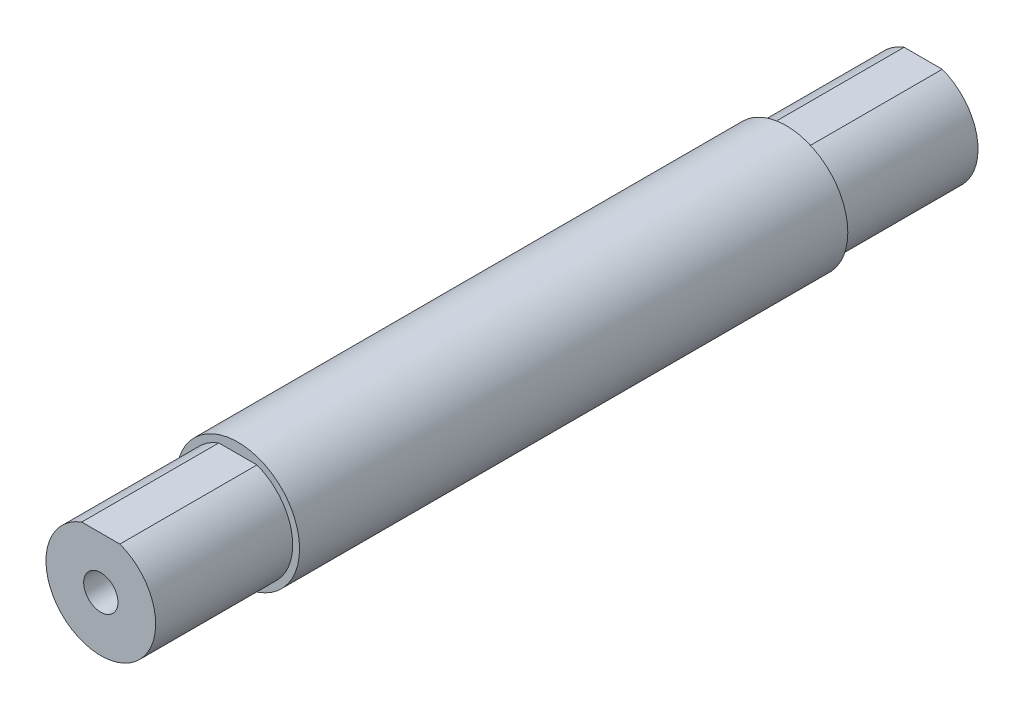
ISO-10303-21;
HEADER;
FILE_DESCRIPTION(('STEP AP214'),'2;1');
FILE_NAME('part.step','',(''),(''),'','','');
FILE_SCHEMA(('AUTOMOTIVE_DESIGN { 1 0 10303 214 1 1 1 1 }'));
ENDSEC;
DATA;
#1=APPLICATION_CONTEXT('core data for automotive mechanical design processes');
#2=APPLICATION_PROTOCOL_DEFINITION('international standard','automotive_design',2000,#1);
#3=PRODUCT_CONTEXT('',#1,'mechanical');
#4=PRODUCT('Part','Part','',(#3));
#5=PRODUCT_RELATED_PRODUCT_CATEGORY('part','',(#4));
#6=PRODUCT_DEFINITION_FORMATION('','',#4);
#7=PRODUCT_DEFINITION_CONTEXT('part definition',#1,'design');
#8=PRODUCT_DEFINITION('design','',#6,#7);
#9=PRODUCT_DEFINITION_SHAPE('','',#8);
#10=(LENGTH_UNIT() NAMED_UNIT(*) SI_UNIT(.MILLI.,.METRE.));
#11=(NAMED_UNIT(*) PLANE_ANGLE_UNIT() SI_UNIT($,.RADIAN.));
#12=(NAMED_UNIT(*) SI_UNIT($,.STERADIAN.) SOLID_ANGLE_UNIT());
#13=UNCERTAINTY_MEASURE_WITH_UNIT(LENGTH_MEASURE(1.E-05),#10,'distance_accuracy_value','');
#14=(GEOMETRIC_REPRESENTATION_CONTEXT(3) GLOBAL_UNCERTAINTY_ASSIGNED_CONTEXT((#13)) GLOBAL_UNIT_ASSIGNED_CONTEXT((#10,
#11,#12)) REPRESENTATION_CONTEXT('',''));
#15=CARTESIAN_POINT('',(0.,0.,0.));
#16=DIRECTION('',(0.,0.,1.));
#17=DIRECTION('',(1.,0.,0.));
#18=AXIS2_PLACEMENT_3D('',#15,#16,#17);
#19=CARTESIAN_POINT('',(0.,7.5,60.));
#20=DIRECTION('',(0.,1.,0.));
#21=DIRECTION('',(0.,0.,1.));
#22=AXIS2_PLACEMENT_3D('',#19,#20,#21);
#23=PLANE('',#22);
#24=DIRECTION('',(1.,0.,0.));
#25=VECTOR('',#24,1.);
#26=CARTESIAN_POINT('',(0.,7.5,40.));
#27=LINE('',#26,#25);
#28=CARTESIAN_POINT('',(-2.78388218141501,7.5,40.));
#29=VERTEX_POINT('',#28);
#30=CARTESIAN_POINT('',(2.78388218141501,7.5,40.));
#31=VERTEX_POINT('',#30);
#32=EDGE_CURVE('E59',#29,#31,#27,.T.);
#33=ORIENTED_EDGE('',*,*,#32,.F.);
#34=DIRECTION('',(0.,0.,-1.));
#35=VECTOR('',#34,1.);
#36=CARTESIAN_POINT('',(-2.78388218141501,7.5,60.));
#37=LINE('',#36,#35);
#38=CARTESIAN_POINT('',(-2.78388218141501,7.5,60.));
#39=VERTEX_POINT('',#38);
#40=EDGE_CURVE('E11',#39,#29,#37,.T.);
#41=ORIENTED_EDGE('',*,*,#40,.F.);
#42=DIRECTION('',(1.,0.,0.));
#43=VECTOR('',#42,1.);
#44=CARTESIAN_POINT('',(0.,7.5,60.));
#45=LINE('',#44,#43);
#46=CARTESIAN_POINT('',(2.78388218141501,7.5,60.));
#47=VERTEX_POINT('',#46);
#48=EDGE_CURVE('E117',#39,#47,#45,.T.);
#49=ORIENTED_EDGE('',*,*,#48,.T.);
#50=DIRECTION('',(0.,0.,-1.));
#51=VECTOR('',#50,1.);
#52=CARTESIAN_POINT('',(2.78388218141501,7.5,60.));
#53=LINE('',#52,#51);
#54=EDGE_CURVE('E127',#47,#31,#53,.T.);
#55=ORIENTED_EDGE('',*,*,#54,.T.);
#56=EDGE_LOOP('',(#33,#41,#49,#55));
#57=FACE_BOUND('',#56,.T.);
#58=ADVANCED_FACE('F38',(#57),#23,.T.);
#59=CARTESIAN_POINT('',(0.,0.,60.));
#60=DIRECTION('',(0.,0.,-1.));
#61=DIRECTION('',(-1.,0.,0.));
#62=AXIS2_PLACEMENT_3D('',#59,#60,#61);
#63=CYLINDRICAL_SURFACE('',#62,8.);
#64=ORIENTED_EDGE('',*,*,#40,.T.);
#65=CARTESIAN_POINT('',(0.,0.,40.));
#66=DIRECTION('',(0.,0.,1.));
#67=DIRECTION('',(1.,0.,0.));
#68=AXIS2_PLACEMENT_3D('',#65,#66,#67);
#69=CIRCLE('',#68,8.);
#70=EDGE_CURVE('E103',#29,#31,#69,.T.);
#71=ORIENTED_EDGE('',*,*,#70,.T.);
#72=ORIENTED_EDGE('',*,*,#54,.F.);
#73=CARTESIAN_POINT('',(0.,0.,60.));
#74=DIRECTION('',(0.,0.,1.));
#75=DIRECTION('',(1.,0.,0.));
#76=AXIS2_PLACEMENT_3D('',#73,#74,#75);
#77=CIRCLE('',#76,8.);
#78=EDGE_CURVE('E120',#39,#47,#77,.T.);
#79=ORIENTED_EDGE('',*,*,#78,.F.);
#80=EDGE_LOOP('',(#64,#71,#72,#79));
#81=FACE_BOUND('',#80,.T.);
#82=ADVANCED_FACE('F147',(#81),#63,.T.);
#83=CARTESIAN_POINT('',(0.,-19.9414213562373,60.));
#84=DIRECTION('',(0.,0.,1.));
#85=DIRECTION('',(1.,0.,0.));
#86=AXIS2_PLACEMENT_3D('',#83,#84,#85);
#87=PLANE('',#86);
#88=CARTESIAN_POINT('',(0.,0.,60.));
#89=DIRECTION('',(0.,0.,1.));
#90=DIRECTION('',(1.,0.,0.));
#91=AXIS2_PLACEMENT_3D('',#88,#89,#90);
#92=CIRCLE('',#91,2.49999999999999);
#93=CARTESIAN_POINT('',(2.49999999999999,0.,60.));
#94=VERTEX_POINT('',#93);
#95=EDGE_CURVE('E92',#94,#94,#92,.T.);
#96=ORIENTED_EDGE('',*,*,#95,.F.);
#97=EDGE_LOOP('',(#96));
#98=FACE_BOUND('',#97,.T.);
#99=ORIENTED_EDGE('',*,*,#48,.F.);
#100=ORIENTED_EDGE('',*,*,#78,.T.);
#101=EDGE_LOOP('',(#99,#100));
#102=FACE_BOUND('',#101,.T.);
#103=ADVANCED_FACE('F157',(#98,#102),#87,.T.);
#104=CARTESIAN_POINT('',(0.,0.,40.));
#105=DIRECTION('',(0.,0.,-1.));
#106=DIRECTION('',(-1.,0.,0.));
#107=AXIS2_PLACEMENT_3D('',#104,#105,#106);
#108=CYLINDRICAL_SURFACE('',#107,9.);
#109=CARTESIAN_POINT('',(0.,0.,40.));
#110=DIRECTION('',(0.,0.,1.));
#111=DIRECTION('',(1.,0.,0.));
#112=AXIS2_PLACEMENT_3D('',#109,#110,#111);
#113=CIRCLE('',#112,9.);
#114=CARTESIAN_POINT('',(9.,0.,40.));
#115=VERTEX_POINT('',#114);
#116=EDGE_CURVE('E107',#115,#115,#113,.T.);
#117=ORIENTED_EDGE('',*,*,#116,.F.);
#118=EDGE_LOOP('',(#117));
#119=FACE_BOUND('',#118,.T.);
#120=CARTESIAN_POINT('',(0.,0.,-40.));
#121=DIRECTION('',(0.,0.,1.));
#122=DIRECTION('',(1.,0.,0.));
#123=AXIS2_PLACEMENT_3D('',#120,#121,#122);
#124=CIRCLE('',#123,9.);
#125=CARTESIAN_POINT('',(9.,0.,-40.));
#126=VERTEX_POINT('',#125);
#127=EDGE_CURVE('E105',#126,#126,#124,.T.);
#128=ORIENTED_EDGE('',*,*,#127,.T.);
#129=EDGE_LOOP('',(#128));
#130=FACE_BOUND('',#129,.T.);
#131=ADVANCED_FACE('F174',(#119,#130),#108,.T.);
#132=CARTESIAN_POINT('',(0.,-19.9414213562373,40.));
#133=DIRECTION('',(0.,0.,1.));
#134=DIRECTION('',(1.,0.,0.));
#135=AXIS2_PLACEMENT_3D('',#132,#133,#134);
#136=PLANE('',#135);
#137=ORIENTED_EDGE('',*,*,#70,.F.);
#138=ORIENTED_EDGE('',*,*,#32,.T.);
#139=EDGE_LOOP('',(#137,#138));
#140=FACE_BOUND('',#139,.T.);
#141=ORIENTED_EDGE('',*,*,#116,.T.);
#142=EDGE_LOOP('',(#141));
#143=FACE_BOUND('',#142,.T.);
#144=ADVANCED_FACE('F148',(#140,#143),#136,.T.);
#145=CARTESIAN_POINT('',(0.,-19.9414213562373,-40.));
#146=DIRECTION('',(0.,0.,1.));
#147=DIRECTION('',(1.,0.,0.));
#148=AXIS2_PLACEMENT_3D('',#145,#146,#147);
#149=PLANE('',#148);
#150=CARTESIAN_POINT('',(0.,0.,-40.));
#151=DIRECTION('',(0.,0.,1.));
#152=DIRECTION('',(1.,0.,0.));
#153=AXIS2_PLACEMENT_3D('',#150,#151,#152);
#154=CIRCLE('',#153,8.);
#155=CARTESIAN_POINT('',(-2.78388218141501,7.5,-40.));
#156=VERTEX_POINT('',#155);
#157=CARTESIAN_POINT('',(2.78388218141501,7.5,-40.));
#158=VERTEX_POINT('',#157);
#159=EDGE_CURVE('E52',#156,#158,#154,.T.);
#160=ORIENTED_EDGE('',*,*,#159,.T.);
#161=DIRECTION('',(1.,0.,0.));
#162=VECTOR('',#161,1.);
#163=CARTESIAN_POINT('',(0.,7.5,-40.));
#164=LINE('',#163,#162);
#165=EDGE_CURVE('E112',#156,#158,#164,.T.);
#166=ORIENTED_EDGE('',*,*,#165,.F.);
#167=EDGE_LOOP('',(#160,#166));
#168=FACE_BOUND('',#167,.T.);
#169=ORIENTED_EDGE('',*,*,#127,.F.);
#170=EDGE_LOOP('',(#169));
#171=FACE_BOUND('',#170,.T.);
#172=ADVANCED_FACE('F140',(#168,#171),#149,.F.);
#173=CARTESIAN_POINT('',(0.,-19.9414213562373,-60.));
#174=DIRECTION('',(0.,0.,1.));
#175=DIRECTION('',(1.,0.,0.));
#176=AXIS2_PLACEMENT_3D('',#173,#174,#175);
#177=PLANE('',#176);
#178=CARTESIAN_POINT('',(0.,0.,-60.));
#179=DIRECTION('',(0.,0.,-1.));
#180=DIRECTION('',(-1.,0.,0.));
#181=AXIS2_PLACEMENT_3D('',#178,#179,#180);
#182=CIRCLE('',#181,2.49999999999999);
#183=CARTESIAN_POINT('',(-2.49999999999999,0.,-60.));
#184=VERTEX_POINT('',#183);
#185=EDGE_CURVE('E93',#184,#184,#182,.T.);
#186=ORIENTED_EDGE('',*,*,#185,.F.);
#187=EDGE_LOOP('',(#186));
#188=FACE_BOUND('',#187,.T.);
#189=DIRECTION('',(1.,0.,0.));
#190=VECTOR('',#189,1.);
#191=CARTESIAN_POINT('',(0.,7.5,-60.));
#192=LINE('',#191,#190);
#193=CARTESIAN_POINT('',(-2.78388218141501,7.5,-60.));
#194=VERTEX_POINT('',#193);
#195=CARTESIAN_POINT('',(2.78388218141501,7.5,-60.));
#196=VERTEX_POINT('',#195);
#197=EDGE_CURVE('E110',#194,#196,#192,.T.);
#198=ORIENTED_EDGE('',*,*,#197,.T.);
#199=CARTESIAN_POINT('',(0.,0.,-60.));
#200=DIRECTION('',(0.,0.,1.));
#201=DIRECTION('',(1.,0.,0.));
#202=AXIS2_PLACEMENT_3D('',#199,#200,#201);
#203=CIRCLE('',#202,8.);
#204=EDGE_CURVE('E121',#194,#196,#203,.T.);
#205=ORIENTED_EDGE('',*,*,#204,.F.);
#206=EDGE_LOOP('',(#198,#205));
#207=FACE_BOUND('',#206,.T.);
#208=ADVANCED_FACE('F138',(#188,#207),#177,.F.);
#209=ORIENTED_EDGE('',*,*,#159,.F.);
#210=EDGE_CURVE('E45',#156,#194,#37,.T.);
#211=ORIENTED_EDGE('',*,*,#210,.T.);
#212=ORIENTED_EDGE('',*,*,#204,.T.);
#213=EDGE_CURVE('E123',#158,#196,#53,.T.);
#214=ORIENTED_EDGE('',*,*,#213,.F.);
#215=EDGE_LOOP('',(#209,#211,#212,#214));
#216=FACE_BOUND('',#215,.T.);
#217=ADVANCED_FACE('F136',(#216),#63,.T.);
#218=ORIENTED_EDGE('',*,*,#210,.F.);
#219=ORIENTED_EDGE('',*,*,#165,.T.);
#220=ORIENTED_EDGE('',*,*,#213,.T.);
#221=ORIENTED_EDGE('',*,*,#197,.F.);
#222=EDGE_LOOP('',(#218,#219,#220,#221));
#223=FACE_BOUND('',#222,.T.);
#224=ADVANCED_FACE('F133',(#223),#23,.T.);
#225=CARTESIAN_POINT('',(0.,0.,42.));
#226=DIRECTION('',(0.,0.,1.));
#227=DIRECTION('',(1.,0.,0.));
#228=AXIS2_PLACEMENT_3D('',#225,#226,#227);
#229=CONICAL_SURFACE('',#228,2.49999999999999,1.02974425867665);
#230=CARTESIAN_POINT('',(0.,0.,40.4978484524311));
#231=VERTEX_POINT('',#230);
#232=VERTEX_LOOP('',#231);
#233=FACE_BOUND('',#232,.T.);
#234=CARTESIAN_POINT('',(0.,0.,42.));
#235=DIRECTION('',(0.,0.,1.));
#236=DIRECTION('',(1.,0.,0.));
#237=AXIS2_PLACEMENT_3D('',#234,#235,#236);
#238=CIRCLE('',#237,2.49999999999999);
#239=CARTESIAN_POINT('',(2.49999999999999,0.,42.));
#240=VERTEX_POINT('',#239);
#241=EDGE_CURVE('E96',#240,#240,#238,.T.);
#242=ORIENTED_EDGE('',*,*,#241,.T.);
#243=EDGE_LOOP('',(#242));
#244=FACE_BOUND('',#243,.T.);
#245=ADVANCED_FACE('F160',(#233,#244),#229,.F.);
#246=CARTESIAN_POINT('',(0.,0.,60.));
#247=DIRECTION('',(0.,0.,1.));
#248=DIRECTION('',(1.,0.,0.));
#249=AXIS2_PLACEMENT_3D('',#246,#247,#248);
#250=CYLINDRICAL_SURFACE('',#249,2.49999999999999);
#251=ORIENTED_EDGE('',*,*,#241,.F.);
#252=EDGE_LOOP('',(#251));
#253=FACE_BOUND('',#252,.T.);
#254=ORIENTED_EDGE('',*,*,#95,.T.);
#255=EDGE_LOOP('',(#254));
#256=FACE_BOUND('',#255,.T.);
#257=ADVANCED_FACE('F86',(#253,#256),#250,.F.);
#258=CARTESIAN_POINT('',(0.,0.,-42.));
#259=DIRECTION('',(0.,0.,-1.));
#260=DIRECTION('',(-1.,0.,0.));
#261=AXIS2_PLACEMENT_3D('',#258,#259,#260);
#262=CONICAL_SURFACE('',#261,2.49999999999999,1.02974425867665);
#263=CARTESIAN_POINT('',(0.,0.,-40.4978484524311));
#264=VERTEX_POINT('',#263);
#265=VERTEX_LOOP('',#264);
#266=FACE_BOUND('',#265,.T.);
#267=CARTESIAN_POINT('',(0.,0.,-42.));
#268=DIRECTION('',(0.,0.,-1.));
#269=DIRECTION('',(-1.,0.,0.));
#270=AXIS2_PLACEMENT_3D('',#267,#268,#269);
#271=CIRCLE('',#270,2.49999999999999);
#272=CARTESIAN_POINT('',(-2.49999999999999,0.,-42.));
#273=VERTEX_POINT('',#272);
#274=EDGE_CURVE('E90',#273,#273,#271,.T.);
#275=ORIENTED_EDGE('',*,*,#274,.T.);
#276=EDGE_LOOP('',(#275));
#277=FACE_BOUND('',#276,.T.);
#278=ADVANCED_FACE('F82',(#266,#277),#262,.F.);
#279=CARTESIAN_POINT('',(0.,0.,-60.));
#280=DIRECTION('',(0.,0.,-1.));
#281=DIRECTION('',(-1.,0.,0.));
#282=AXIS2_PLACEMENT_3D('',#279,#280,#281);
#283=CYLINDRICAL_SURFACE('',#282,2.49999999999999);
#284=ORIENTED_EDGE('',*,*,#274,.F.);
#285=EDGE_LOOP('',(#284));
#286=FACE_BOUND('',#285,.T.);
#287=ORIENTED_EDGE('',*,*,#185,.T.);
#288=EDGE_LOOP('',(#287));
#289=FACE_BOUND('',#288,.T.);
#290=ADVANCED_FACE('F85',(#286,#289),#283,.F.);
#291=CLOSED_SHELL('',(#58,#82,#103,#131,#144,#172,#208,#217,#224,#245,#257,#278,#290));
#292=MANIFOLD_SOLID_BREP('B2',#291);
#293=ADVANCED_BREP_SHAPE_REPRESENTATION('',(#18,#292),#14);
#294=SHAPE_DEFINITION_REPRESENTATION(#9,#293);
ENDSEC;
END-ISO-10303-21;
